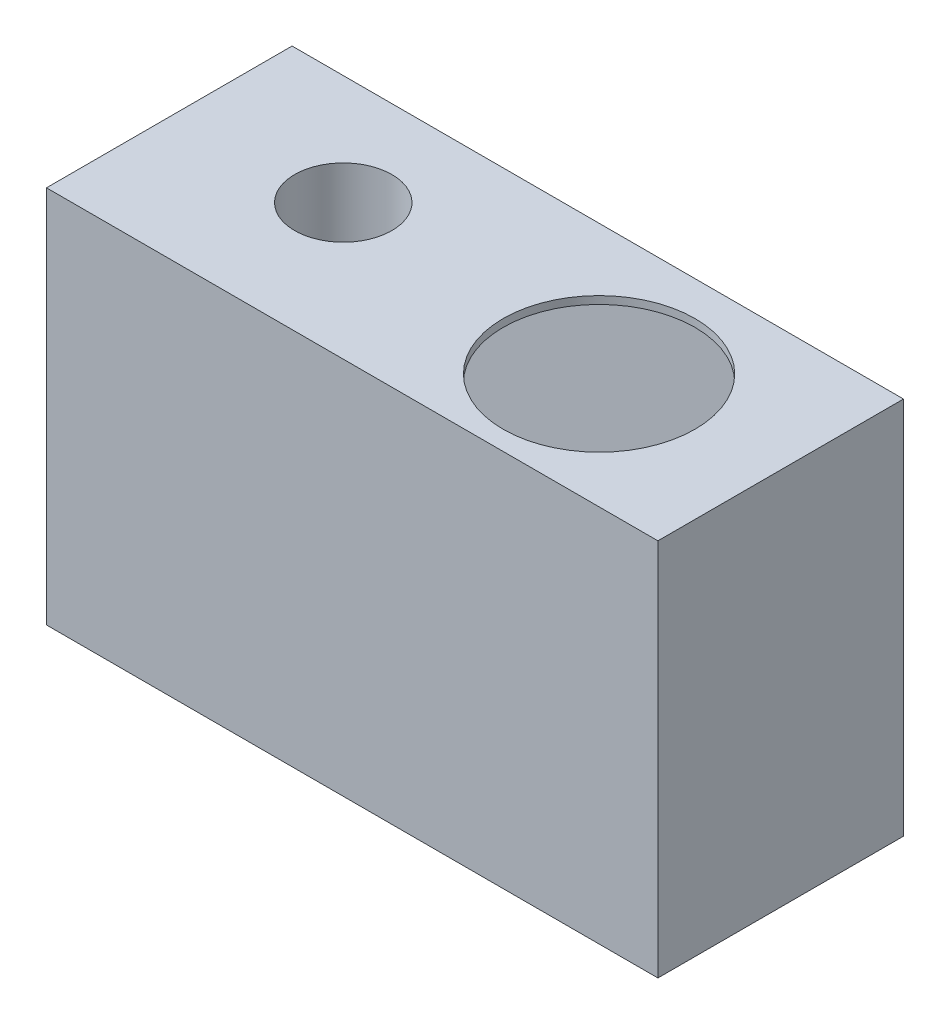
ISO-10303-21;
HEADER;
FILE_DESCRIPTION(('STEP AP214'),'2;1');
FILE_NAME('part.step','',(''),(''),'','','');
FILE_SCHEMA(('AUTOMOTIVE_DESIGN { 1 0 10303 214 1 1 1 1 }'));
ENDSEC;
DATA;
#1=APPLICATION_CONTEXT('core data for automotive mechanical design processes');
#2=APPLICATION_PROTOCOL_DEFINITION('international standard','automotive_design',2000,#1);
#3=PRODUCT_CONTEXT('',#1,'mechanical');
#4=PRODUCT('Part','Part','',(#3));
#5=PRODUCT_RELATED_PRODUCT_CATEGORY('part','',(#4));
#6=PRODUCT_DEFINITION_FORMATION('','',#4);
#7=PRODUCT_DEFINITION_CONTEXT('part definition',#1,'design');
#8=PRODUCT_DEFINITION('design','',#6,#7);
#9=PRODUCT_DEFINITION_SHAPE('','',#8);
#10=(LENGTH_UNIT() NAMED_UNIT(*) SI_UNIT(.MILLI.,.METRE.));
#11=(NAMED_UNIT(*) PLANE_ANGLE_UNIT() SI_UNIT($,.RADIAN.));
#12=(NAMED_UNIT(*) SI_UNIT($,.STERADIAN.) SOLID_ANGLE_UNIT());
#13=UNCERTAINTY_MEASURE_WITH_UNIT(LENGTH_MEASURE(1.E-05),#10,'distance_accuracy_value','');
#14=(GEOMETRIC_REPRESENTATION_CONTEXT(3) GLOBAL_UNCERTAINTY_ASSIGNED_CONTEXT((#13)) GLOBAL_UNIT_ASSIGNED_CONTEXT((#10,
#11,#12)) REPRESENTATION_CONTEXT('',''));
#15=CARTESIAN_POINT('',(0.,0.,0.));
#16=DIRECTION('',(0.,0.,1.));
#17=DIRECTION('',(1.,0.,0.));
#18=AXIS2_PLACEMENT_3D('',#15,#16,#17);
#19=CARTESIAN_POINT('',(0.,0.,0.));
#20=DIRECTION('',(0.,1.,0.));
#21=DIRECTION('',(0.,0.,1.));
#22=AXIS2_PLACEMENT_3D('',#19,#20,#21);
#23=PLANE('',#22);
#24=DIRECTION('',(0.,0.,-1.));
#25=VECTOR('',#24,1.);
#26=CARTESIAN_POINT('',(3.,0.,3.));
#27=LINE('',#26,#25);
#28=CARTESIAN_POINT('',(2.99999999999999,0.,93.));
#29=VERTEX_POINT('',#28);
#30=CARTESIAN_POINT('',(3.,0.,3.));
#31=VERTEX_POINT('',#30);
#32=EDGE_CURVE('E109',#29,#31,#27,.T.);
#33=ORIENTED_EDGE('',*,*,#32,.T.);
#34=DIRECTION('',(1.,0.,0.));
#35=VECTOR('',#34,1.);
#36=CARTESIAN_POINT('',(3.,0.,3.));
#37=LINE('',#36,#35);
#38=CARTESIAN_POINT('',(236.,0.,3.00000000000003));
#39=VERTEX_POINT('',#38);
#40=EDGE_CURVE('E129',#31,#39,#37,.T.);
#41=ORIENTED_EDGE('',*,*,#40,.T.);
#42=DIRECTION('',(0.,0.,1.));
#43=VECTOR('',#42,1.);
#44=CARTESIAN_POINT('',(236.,0.,3.00000000000003));
#45=LINE('',#44,#43);
#46=CARTESIAN_POINT('',(236.,0.,93.));
#47=VERTEX_POINT('',#46);
#48=EDGE_CURVE('E115',#39,#47,#45,.T.);
#49=ORIENTED_EDGE('',*,*,#48,.T.);
#50=DIRECTION('',(-1.,0.,0.));
#51=VECTOR('',#50,1.);
#52=CARTESIAN_POINT('',(2.99999999999999,0.,93.));
#53=LINE('',#52,#51);
#54=EDGE_CURVE('E133',#47,#29,#53,.T.);
#55=ORIENTED_EDGE('',*,*,#54,.T.);
#56=EDGE_LOOP('',(#33,#41,#49,#55));
#57=FACE_BOUND('',#56,.T.);
#58=CARTESIAN_POINT('',(171.,0.,51.));
#59=DIRECTION('',(0.,-1.,0.));
#60=DIRECTION('',(0.,0.,-1.));
#61=AXIS2_PLACEMENT_3D('',#58,#59,#60);
#62=CIRCLE('',#61,37.5);
#63=CARTESIAN_POINT('',(171.,0.,13.5));
#64=VERTEX_POINT('',#63);
#65=EDGE_CURVE('E341',#64,#64,#62,.T.);
#66=ORIENTED_EDGE('',*,*,#65,.F.);
#67=EDGE_LOOP('',(#66));
#68=FACE_BOUND('',#67,.T.);
#69=CARTESIAN_POINT('',(63.,0.,43.));
#70=DIRECTION('',(0.,1.,0.));
#71=DIRECTION('',(0.,0.,1.));
#72=AXIS2_PLACEMENT_3D('',#69,#70,#71);
#73=CIRCLE('',#72,22.);
#74=CARTESIAN_POINT('',(63.,0.,65.));
#75=VERTEX_POINT('',#74);
#76=EDGE_CURVE('E11',#75,#75,#73,.F.);
#77=ORIENTED_EDGE('',*,*,#76,.F.);
#78=EDGE_LOOP('',(#77));
#79=FACE_BOUND('',#78,.T.);
#80=ADVANCED_FACE('F33',(#57,#68,#79),#23,.F.);
#81=CARTESIAN_POINT('',(0.,3.,0.));
#82=DIRECTION('',(1.,0.,0.));
#83=DIRECTION('',(0.,0.,-1.));
#84=AXIS2_PLACEMENT_3D('',#81,#82,#83);
#85=PLANE('',#84);
#86=DIRECTION('',(0.,-1.,0.));
#87=VECTOR('',#86,1.);
#88=CARTESIAN_POINT('',(0.,3.,0.));
#89=LINE('',#88,#87);
#90=CARTESIAN_POINT('',(0.,3.,0.));
#91=VERTEX_POINT('',#90);
#92=CARTESIAN_POINT('',(0.,-145.,0.));
#93=VERTEX_POINT('',#92);
#94=EDGE_CURVE('E160',#91,#93,#89,.T.);
#95=ORIENTED_EDGE('',*,*,#94,.T.);
#96=DIRECTION('',(0.,0.,-1.));
#97=VECTOR('',#96,1.);
#98=CARTESIAN_POINT('',(0.,-145.,0.));
#99=LINE('',#98,#97);
#100=CARTESIAN_POINT('',(0.,-145.,96.));
#101=VERTEX_POINT('',#100);
#102=EDGE_CURVE('E116',#101,#93,#99,.T.);
#103=ORIENTED_EDGE('',*,*,#102,.F.);
#104=DIRECTION('',(0.,-1.,0.));
#105=VECTOR('',#104,1.);
#106=CARTESIAN_POINT('',(0.,3.,96.));
#107=LINE('',#106,#105);
#108=CARTESIAN_POINT('',(0.,3.,96.));
#109=VERTEX_POINT('',#108);
#110=EDGE_CURVE('E41',#109,#101,#107,.T.);
#111=ORIENTED_EDGE('',*,*,#110,.F.);
#112=DIRECTION('',(0.,0.,1.));
#113=VECTOR('',#112,1.);
#114=CARTESIAN_POINT('',(0.,3.,0.));
#115=LINE('',#114,#113);
#116=EDGE_CURVE('E153',#91,#109,#115,.T.);
#117=ORIENTED_EDGE('',*,*,#116,.F.);
#118=EDGE_LOOP('',(#95,#103,#111,#117));
#119=FACE_BOUND('',#118,.T.);
#120=ADVANCED_FACE('F35',(#119),#85,.F.);
#121=CARTESIAN_POINT('',(0.,3.,96.));
#122=DIRECTION('',(0.,0.,-1.));
#123=DIRECTION('',(-1.,0.,0.));
#124=AXIS2_PLACEMENT_3D('',#121,#122,#123);
#125=PLANE('',#124);
#126=ORIENTED_EDGE('',*,*,#110,.T.);
#127=DIRECTION('',(-1.,0.,0.));
#128=VECTOR('',#127,1.);
#129=CARTESIAN_POINT('',(0.,-145.,96.));
#130=LINE('',#129,#128);
#131=CARTESIAN_POINT('',(239.,-145.,96.));
#132=VERTEX_POINT('',#131);
#133=EDGE_CURVE('E150',#132,#101,#130,.T.);
#134=ORIENTED_EDGE('',*,*,#133,.F.);
#135=DIRECTION('',(0.,-1.,0.));
#136=VECTOR('',#135,1.);
#137=CARTESIAN_POINT('',(239.,3.,96.));
#138=LINE('',#137,#136);
#139=CARTESIAN_POINT('',(239.,3.,96.));
#140=VERTEX_POINT('',#139);
#141=EDGE_CURVE('E164',#140,#132,#138,.T.);
#142=ORIENTED_EDGE('',*,*,#141,.F.);
#143=DIRECTION('',(1.,0.,0.));
#144=VECTOR('',#143,1.);
#145=CARTESIAN_POINT('',(0.,3.,96.));
#146=LINE('',#145,#144);
#147=EDGE_CURVE('E155',#109,#140,#146,.T.);
#148=ORIENTED_EDGE('',*,*,#147,.F.);
#149=EDGE_LOOP('',(#126,#134,#142,#148));
#150=FACE_BOUND('',#149,.T.);
#151=ADVANCED_FACE('F168',(#150),#125,.F.);
#152=CARTESIAN_POINT('',(239.,3.,0.));
#153=DIRECTION('',(-1.,0.,0.));
#154=DIRECTION('',(0.,0.,1.));
#155=AXIS2_PLACEMENT_3D('',#152,#153,#154);
#156=PLANE('',#155);
#157=ORIENTED_EDGE('',*,*,#141,.T.);
#158=DIRECTION('',(0.,0.,1.));
#159=VECTOR('',#158,1.);
#160=CARTESIAN_POINT('',(239.,-145.,0.));
#161=LINE('',#160,#159);
#162=CARTESIAN_POINT('',(239.,-145.,0.));
#163=VERTEX_POINT('',#162);
#164=EDGE_CURVE('E147',#163,#132,#161,.T.);
#165=ORIENTED_EDGE('',*,*,#164,.F.);
#166=DIRECTION('',(0.,-1.,0.));
#167=VECTOR('',#166,1.);
#168=CARTESIAN_POINT('',(239.,3.,0.));
#169=LINE('',#168,#167);
#170=CARTESIAN_POINT('',(239.,3.,0.));
#171=VERTEX_POINT('',#170);
#172=EDGE_CURVE('E162',#171,#163,#169,.T.);
#173=ORIENTED_EDGE('',*,*,#172,.F.);
#174=DIRECTION('',(0.,0.,-1.));
#175=VECTOR('',#174,1.);
#176=CARTESIAN_POINT('',(239.,3.,0.));
#177=LINE('',#176,#175);
#178=EDGE_CURVE('E157',#140,#171,#177,.T.);
#179=ORIENTED_EDGE('',*,*,#178,.F.);
#180=EDGE_LOOP('',(#157,#165,#173,#179));
#181=FACE_BOUND('',#180,.T.);
#182=ADVANCED_FACE('F180',(#181),#156,.F.);
#183=CARTESIAN_POINT('',(0.,3.,0.));
#184=DIRECTION('',(0.,0.,1.));
#185=DIRECTION('',(1.,0.,0.));
#186=AXIS2_PLACEMENT_3D('',#183,#184,#185);
#187=PLANE('',#186);
#188=ORIENTED_EDGE('',*,*,#172,.T.);
#189=DIRECTION('',(1.,0.,0.));
#190=VECTOR('',#189,1.);
#191=CARTESIAN_POINT('',(0.,-145.,0.));
#192=LINE('',#191,#190);
#193=EDGE_CURVE('E144',#93,#163,#192,.T.);
#194=ORIENTED_EDGE('',*,*,#193,.F.);
#195=ORIENTED_EDGE('',*,*,#94,.F.);
#196=DIRECTION('',(-1.,0.,0.));
#197=VECTOR('',#196,1.);
#198=CARTESIAN_POINT('',(0.,3.,0.));
#199=LINE('',#198,#197);
#200=EDGE_CURVE('E56',#171,#91,#199,.T.);
#201=ORIENTED_EDGE('',*,*,#200,.F.);
#202=EDGE_LOOP('',(#188,#194,#195,#201));
#203=FACE_BOUND('',#202,.T.);
#204=ADVANCED_FACE('F177',(#203),#187,.F.);
#205=CARTESIAN_POINT('',(0.,3.,0.));
#206=DIRECTION('',(0.,1.,0.));
#207=DIRECTION('',(0.,0.,1.));
#208=AXIS2_PLACEMENT_3D('',#205,#206,#207);
#209=PLANE('',#208);
#210=CARTESIAN_POINT('',(63.,3.,43.));
#211=DIRECTION('',(0.,-1.,0.));
#212=DIRECTION('',(0.,0.,-1.));
#213=AXIS2_PLACEMENT_3D('',#210,#211,#212);
#214=CIRCLE('',#213,19.);
#215=CARTESIAN_POINT('',(63.,3.,24.));
#216=VERTEX_POINT('',#215);
#217=EDGE_CURVE('E338',#216,#216,#214,.T.);
#218=ORIENTED_EDGE('',*,*,#217,.T.);
#219=EDGE_LOOP('',(#218));
#220=FACE_BOUND('',#219,.T.);
#221=CARTESIAN_POINT('',(171.,3.,51.));
#222=DIRECTION('',(0.,-1.,0.));
#223=DIRECTION('',(0.,0.,-1.));
#224=AXIS2_PLACEMENT_3D('',#221,#222,#223);
#225=CIRCLE('',#224,37.5);
#226=CARTESIAN_POINT('',(171.,3.,13.5));
#227=VERTEX_POINT('',#226);
#228=EDGE_CURVE('E131',#227,#227,#225,.T.);
#229=ORIENTED_EDGE('',*,*,#228,.T.);
#230=EDGE_LOOP('',(#229));
#231=FACE_BOUND('',#230,.T.);
#232=ORIENTED_EDGE('',*,*,#116,.T.);
#233=ORIENTED_EDGE('',*,*,#147,.T.);
#234=ORIENTED_EDGE('',*,*,#178,.T.);
#235=ORIENTED_EDGE('',*,*,#200,.T.);
#236=EDGE_LOOP('',(#232,#233,#234,#235));
#237=FACE_BOUND('',#236,.T.);
#238=ADVANCED_FACE('F182',(#220,#231,#237),#209,.T.);
#239=CARTESIAN_POINT('',(0.,-145.,0.));
#240=DIRECTION('',(0.,1.,0.));
#241=DIRECTION('',(0.,0.,1.));
#242=AXIS2_PLACEMENT_3D('',#239,#240,#241);
#243=PLANE('',#242);
#244=ORIENTED_EDGE('',*,*,#102,.T.);
#245=ORIENTED_EDGE('',*,*,#193,.T.);
#246=ORIENTED_EDGE('',*,*,#164,.T.);
#247=ORIENTED_EDGE('',*,*,#133,.T.);
#248=EDGE_LOOP('',(#244,#245,#246,#247));
#249=FACE_BOUND('',#248,.T.);
#250=DIRECTION('',(1.,0.,0.));
#251=VECTOR('',#250,1.);
#252=CARTESIAN_POINT('',(3.,-145.,3.));
#253=LINE('',#252,#251);
#254=CARTESIAN_POINT('',(3.,-145.,3.));
#255=VERTEX_POINT('',#254);
#256=CARTESIAN_POINT('',(236.,-145.,3.00000000000003));
#257=VERTEX_POINT('',#256);
#258=EDGE_CURVE('E100',#255,#257,#253,.T.);
#259=ORIENTED_EDGE('',*,*,#258,.F.);
#260=DIRECTION('',(0.,0.,-1.));
#261=VECTOR('',#260,1.);
#262=CARTESIAN_POINT('',(3.,-145.,3.));
#263=LINE('',#262,#261);
#264=CARTESIAN_POINT('',(2.99999999999999,-145.,93.));
#265=VERTEX_POINT('',#264);
#266=EDGE_CURVE('E124',#265,#255,#263,.T.);
#267=ORIENTED_EDGE('',*,*,#266,.F.);
#268=DIRECTION('',(-1.,0.,0.));
#269=VECTOR('',#268,1.);
#270=CARTESIAN_POINT('',(2.99999999999999,-145.,93.));
#271=LINE('',#270,#269);
#272=CARTESIAN_POINT('',(236.,-145.,93.));
#273=VERTEX_POINT('',#272);
#274=EDGE_CURVE('E122',#273,#265,#271,.T.);
#275=ORIENTED_EDGE('',*,*,#274,.F.);
#276=DIRECTION('',(0.,0.,1.));
#277=VECTOR('',#276,1.);
#278=CARTESIAN_POINT('',(236.,-145.,3.00000000000003));
#279=LINE('',#278,#277);
#280=EDGE_CURVE('E108',#257,#273,#279,.T.);
#281=ORIENTED_EDGE('',*,*,#280,.F.);
#282=EDGE_LOOP('',(#259,#267,#275,#281));
#283=FACE_BOUND('',#282,.T.);
#284=ADVANCED_FACE('F120',(#249,#283),#243,.F.);
#285=CARTESIAN_POINT('',(3.,-145.,3.));
#286=DIRECTION('',(0.,0.,1.));
#287=DIRECTION('',(1.,0.,0.));
#288=AXIS2_PLACEMENT_3D('',#285,#286,#287);
#289=PLANE('',#288);
#290=ORIENTED_EDGE('',*,*,#40,.F.);
#291=DIRECTION('',(0.,1.,0.));
#292=VECTOR('',#291,1.);
#293=CARTESIAN_POINT('',(3.,-145.,3.));
#294=LINE('',#293,#292);
#295=EDGE_CURVE('E48',#255,#31,#294,.T.);
#296=ORIENTED_EDGE('',*,*,#295,.F.);
#297=ORIENTED_EDGE('',*,*,#258,.T.);
#298=DIRECTION('',(0.,1.,0.));
#299=VECTOR('',#298,1.);
#300=CARTESIAN_POINT('',(236.,-145.,3.00000000000003));
#301=LINE('',#300,#299);
#302=EDGE_CURVE('E103',#257,#39,#301,.T.);
#303=ORIENTED_EDGE('',*,*,#302,.T.);
#304=EDGE_LOOP('',(#290,#296,#297,#303));
#305=FACE_BOUND('',#304,.T.);
#306=ADVANCED_FACE('F102',(#305),#289,.T.);
#307=CARTESIAN_POINT('',(236.,-145.,3.00000000000003));
#308=DIRECTION('',(-1.,0.,0.));
#309=DIRECTION('',(0.,0.,1.));
#310=AXIS2_PLACEMENT_3D('',#307,#308,#309);
#311=PLANE('',#310);
#312=ORIENTED_EDGE('',*,*,#48,.F.);
#313=ORIENTED_EDGE('',*,*,#302,.F.);
#314=ORIENTED_EDGE('',*,*,#280,.T.);
#315=DIRECTION('',(0.,1.,0.));
#316=VECTOR('',#315,1.);
#317=CARTESIAN_POINT('',(236.,-145.,93.));
#318=LINE('',#317,#316);
#319=EDGE_CURVE('E117',#273,#47,#318,.T.);
#320=ORIENTED_EDGE('',*,*,#319,.T.);
#321=EDGE_LOOP('',(#312,#313,#314,#320));
#322=FACE_BOUND('',#321,.T.);
#323=ADVANCED_FACE('F112',(#322),#311,.T.);
#324=CARTESIAN_POINT('',(2.99999999999999,-145.,93.));
#325=DIRECTION('',(0.,0.,-1.));
#326=DIRECTION('',(-1.,0.,0.));
#327=AXIS2_PLACEMENT_3D('',#324,#325,#326);
#328=PLANE('',#327);
#329=ORIENTED_EDGE('',*,*,#54,.F.);
#330=ORIENTED_EDGE('',*,*,#319,.F.);
#331=ORIENTED_EDGE('',*,*,#274,.T.);
#332=DIRECTION('',(0.,1.,0.));
#333=VECTOR('',#332,1.);
#334=CARTESIAN_POINT('',(2.99999999999999,-145.,93.));
#335=LINE('',#334,#333);
#336=EDGE_CURVE('E139',#265,#29,#335,.T.);
#337=ORIENTED_EDGE('',*,*,#336,.T.);
#338=EDGE_LOOP('',(#329,#330,#331,#337));
#339=FACE_BOUND('',#338,.T.);
#340=ADVANCED_FACE('F240',(#339),#328,.T.);
#341=CARTESIAN_POINT('',(3.,-145.,3.));
#342=DIRECTION('',(1.,0.,0.));
#343=DIRECTION('',(0.,0.,-1.));
#344=AXIS2_PLACEMENT_3D('',#341,#342,#343);
#345=PLANE('',#344);
#346=ORIENTED_EDGE('',*,*,#32,.F.);
#347=ORIENTED_EDGE('',*,*,#336,.F.);
#348=ORIENTED_EDGE('',*,*,#266,.T.);
#349=ORIENTED_EDGE('',*,*,#295,.T.);
#350=EDGE_LOOP('',(#346,#347,#348,#349));
#351=FACE_BOUND('',#350,.T.);
#352=ADVANCED_FACE('F247',(#351),#345,.T.);
#353=CARTESIAN_POINT('',(171.,3.,51.));
#354=DIRECTION('',(0.,-1.,0.));
#355=DIRECTION('',(0.,0.,-1.));
#356=AXIS2_PLACEMENT_3D('',#353,#354,#355);
#357=CYLINDRICAL_SURFACE('',#356,37.5);
#358=ORIENTED_EDGE('',*,*,#228,.F.);
#359=EDGE_LOOP('',(#358));
#360=FACE_BOUND('',#359,.T.);
#361=ORIENTED_EDGE('',*,*,#65,.T.);
#362=EDGE_LOOP('',(#361));
#363=FACE_BOUND('',#362,.T.);
#364=ADVANCED_FACE('F255',(#360,#363),#357,.F.);
#365=CARTESIAN_POINT('',(63.,3.,43.));
#366=DIRECTION('',(0.,-1.,0.));
#367=DIRECTION('',(0.,0.,-1.));
#368=AXIS2_PLACEMENT_3D('',#365,#366,#367);
#369=CYLINDRICAL_SURFACE('',#368,19.);
#370=ORIENTED_EDGE('',*,*,#217,.F.);
#371=EDGE_LOOP('',(#370));
#372=FACE_BOUND('',#371,.T.);
#373=CARTESIAN_POINT('',(63.,-53.,43.));
#374=DIRECTION('',(0.,-1.,0.));
#375=DIRECTION('',(0.,0.,-1.));
#376=AXIS2_PLACEMENT_3D('',#373,#374,#375);
#377=CIRCLE('',#376,19.);
#378=CARTESIAN_POINT('',(63.,-53.,24.));
#379=VERTEX_POINT('',#378);
#380=EDGE_CURVE('E339',#379,#379,#377,.T.);
#381=ORIENTED_EDGE('',*,*,#380,.T.);
#382=EDGE_LOOP('',(#381));
#383=FACE_BOUND('',#382,.T.);
#384=ADVANCED_FACE('F267',(#372,#383),#369,.F.);
#385=CARTESIAN_POINT('',(63.,-53.,43.));
#386=DIRECTION('',(0.,-1.,0.));
#387=DIRECTION('',(0.,0.,-1.));
#388=AXIS2_PLACEMENT_3D('',#385,#386,#387);
#389=PLANE('',#388);
#390=CARTESIAN_POINT('',(63.,-53.,43.));
#391=DIRECTION('',(0.,-1.,0.));
#392=DIRECTION('',(0.,0.,-1.));
#393=AXIS2_PLACEMENT_3D('',#390,#391,#392);
#394=CIRCLE('',#393,22.);
#395=CARTESIAN_POINT('',(63.,-53.,21.));
#396=VERTEX_POINT('',#395);
#397=EDGE_CURVE('E335',#396,#396,#394,.T.);
#398=ORIENTED_EDGE('',*,*,#397,.T.);
#399=EDGE_LOOP('',(#398));
#400=FACE_BOUND('',#399,.T.);
#401=ORIENTED_EDGE('',*,*,#380,.F.);
#402=EDGE_LOOP('',(#401));
#403=FACE_BOUND('',#402,.T.);
#404=ADVANCED_FACE('F274',(#400,#403),#389,.T.);
#405=CARTESIAN_POINT('',(63.,-53.,43.));
#406=DIRECTION('',(0.,1.,0.));
#407=DIRECTION('',(0.,0.,1.));
#408=AXIS2_PLACEMENT_3D('',#405,#406,#407);
#409=CYLINDRICAL_SURFACE('',#408,22.);
#410=ORIENTED_EDGE('',*,*,#397,.F.);
#411=EDGE_LOOP('',(#410));
#412=FACE_BOUND('',#411,.T.);
#413=ORIENTED_EDGE('',*,*,#76,.T.);
#414=EDGE_LOOP('',(#413));
#415=FACE_BOUND('',#414,.T.);
#416=ADVANCED_FACE('F281',(#412,#415),#409,.T.);
#417=CLOSED_SHELL('',(#80,#120,#151,#182,#204,#238,#284,#306,#323,#340,#352,#364,#384,#404,#416));
#418=MANIFOLD_SOLID_BREP('B2',#417);
#419=ADVANCED_BREP_SHAPE_REPRESENTATION('',(#18,#418),#14);
#420=SHAPE_DEFINITION_REPRESENTATION(#9,#419);
ENDSEC;
END-ISO-10303-21;
